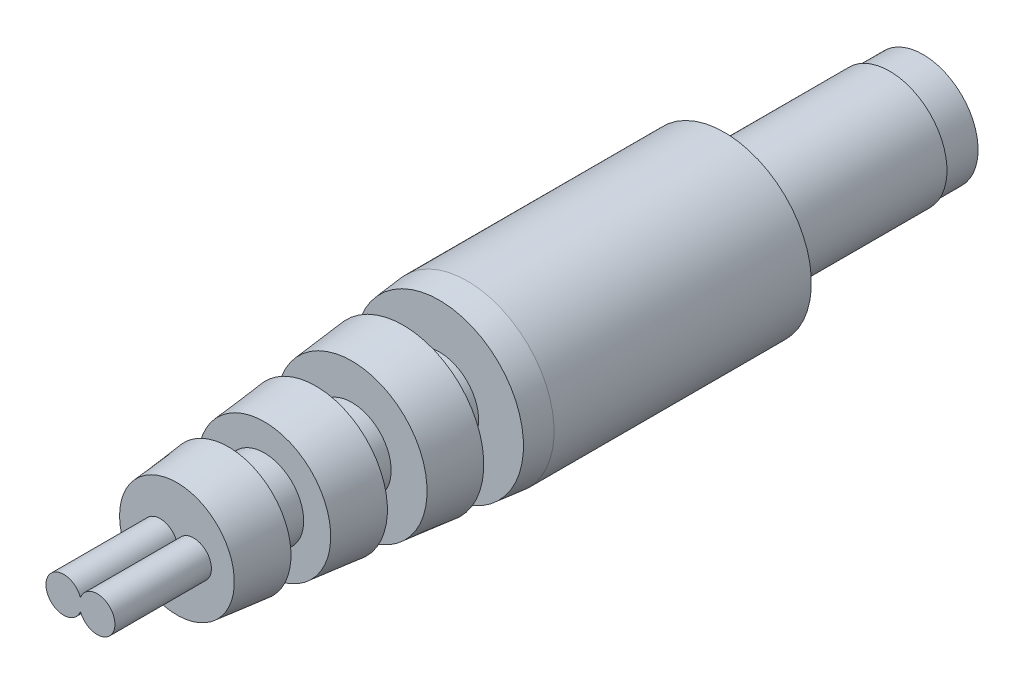
ISO-10303-21;
HEADER;
FILE_DESCRIPTION(('STEP AP214'),'2;1');
FILE_NAME('part.step','',(''),(''),'','','');
FILE_SCHEMA(('AUTOMOTIVE_DESIGN { 1 0 10303 214 1 1 1 1 }'));
ENDSEC;
DATA;
#1=APPLICATION_CONTEXT('core data for automotive mechanical design processes');
#2=APPLICATION_PROTOCOL_DEFINITION('international standard','automotive_design',2000,#1);
#3=PRODUCT_CONTEXT('',#1,'mechanical');
#4=PRODUCT('Part','Part','',(#3));
#5=PRODUCT_RELATED_PRODUCT_CATEGORY('part','',(#4));
#6=PRODUCT_DEFINITION_FORMATION('','',#4);
#7=PRODUCT_DEFINITION_CONTEXT('part definition',#1,'design');
#8=PRODUCT_DEFINITION('design','',#6,#7);
#9=PRODUCT_DEFINITION_SHAPE('','',#8);
#10=(LENGTH_UNIT() NAMED_UNIT(*) SI_UNIT(.MILLI.,.METRE.));
#11=(NAMED_UNIT(*) PLANE_ANGLE_UNIT() SI_UNIT($,.RADIAN.));
#12=(NAMED_UNIT(*) SI_UNIT($,.STERADIAN.) SOLID_ANGLE_UNIT());
#13=UNCERTAINTY_MEASURE_WITH_UNIT(LENGTH_MEASURE(1.E-05),#10,'distance_accuracy_value','');
#14=(GEOMETRIC_REPRESENTATION_CONTEXT(3) GLOBAL_UNCERTAINTY_ASSIGNED_CONTEXT((#13)) GLOBAL_UNIT_ASSIGNED_CONTEXT((#10,
#11,#12)) REPRESENTATION_CONTEXT('',''));
#15=CARTESIAN_POINT('',(0.,0.,0.));
#16=DIRECTION('',(0.,0.,1.));
#17=DIRECTION('',(1.,0.,0.));
#18=AXIS2_PLACEMENT_3D('',#15,#16,#17);
#19=CARTESIAN_POINT('',(0.,0.,41.5925));
#20=DIRECTION('',(0.,0.,-1.));
#21=DIRECTION('',(-1.,0.,0.));
#22=AXIS2_PLACEMENT_3D('',#19,#20,#21);
#23=PLANE('',#22);
#24=CARTESIAN_POINT('',(-0.826236930167257,0.,41.5925));
#25=DIRECTION('',(0.,0.,-1.));
#26=DIRECTION('',(-1.,0.,0.));
#27=AXIS2_PLACEMENT_3D('',#24,#25,#26);
#28=CIRCLE('',#27,0.8763);
#29=CARTESIAN_POINT('',(0.,-0.291949011349221,41.5925));
#30=VERTEX_POINT('',#29);
#31=CARTESIAN_POINT('',(0.,0.291949011349221,41.5925));
#32=VERTEX_POINT('',#31);
#33=EDGE_CURVE('E46',#30,#32,#28,.T.);
#34=ORIENTED_EDGE('',*,*,#33,.F.);
#35=CARTESIAN_POINT('',(0.826236930167257,0.,41.5925));
#36=DIRECTION('',(0.,0.,-1.));
#37=DIRECTION('',(-1.,0.,0.));
#38=AXIS2_PLACEMENT_3D('',#35,#36,#37);
#39=CIRCLE('',#38,0.8763);
#40=EDGE_CURVE('E20',#32,#30,#39,.T.);
#41=ORIENTED_EDGE('',*,*,#40,.F.);
#42=EDGE_LOOP('',(#34,#41));
#43=FACE_BOUND('',#42,.T.);
#44=ADVANCED_FACE('F17',(#43),#23,.F.);
#45=CARTESIAN_POINT('',(0.826236930167257,0.,41.5925));
#46=DIRECTION('',(0.,0.,-1.));
#47=DIRECTION('',(-1.,0.,0.));
#48=AXIS2_PLACEMENT_3D('',#45,#46,#47);
#49=CYLINDRICAL_SURFACE('',#48,0.8763);
#50=ORIENTED_EDGE('',*,*,#40,.T.);
#51=DIRECTION('',(0.,0.,-1.));
#52=VECTOR('',#51,1.);
#53=CARTESIAN_POINT('',(0.,-0.291949011349221,41.5925));
#54=LINE('',#53,#52);
#55=CARTESIAN_POINT('',(0.,-0.291949011349221,36.83));
#56=VERTEX_POINT('',#55);
#57=EDGE_CURVE('E48',#56,#30,#54,.F.);
#58=ORIENTED_EDGE('',*,*,#57,.F.);
#59=CARTESIAN_POINT('',(0.826236930167257,0.,36.83));
#60=DIRECTION('',(0.,0.,-1.));
#61=DIRECTION('',(-1.,0.,0.));
#62=AXIS2_PLACEMENT_3D('',#59,#60,#61);
#63=CIRCLE('',#62,0.8763);
#64=CARTESIAN_POINT('',(0.,0.291949011349221,36.83));
#65=VERTEX_POINT('',#64);
#66=EDGE_CURVE('E115',#65,#56,#63,.T.);
#67=ORIENTED_EDGE('',*,*,#66,.F.);
#68=DIRECTION('',(0.,0.,-1.));
#69=VECTOR('',#68,1.);
#70=CARTESIAN_POINT('',(0.,0.291949011349221,41.5925));
#71=LINE('',#70,#69);
#72=EDGE_CURVE('E47',#32,#65,#71,.T.);
#73=ORIENTED_EDGE('',*,*,#72,.F.);
#74=EDGE_LOOP('',(#50,#58,#67,#73));
#75=FACE_BOUND('',#74,.T.);
#76=ADVANCED_FACE('F50',(#75),#49,.T.);
#77=CARTESIAN_POINT('',(-0.826236930167257,0.,41.5925));
#78=DIRECTION('',(0.,0.,-1.));
#79=DIRECTION('',(-1.,0.,0.));
#80=AXIS2_PLACEMENT_3D('',#77,#78,#79);
#81=CYLINDRICAL_SURFACE('',#80,0.8763);
#82=ORIENTED_EDGE('',*,*,#72,.T.);
#83=CARTESIAN_POINT('',(-0.826236930167257,0.,36.83));
#84=DIRECTION('',(0.,0.,-1.));
#85=DIRECTION('',(-1.,0.,0.));
#86=AXIS2_PLACEMENT_3D('',#83,#84,#85);
#87=CIRCLE('',#86,0.8763);
#88=EDGE_CURVE('E35',#56,#65,#87,.T.);
#89=ORIENTED_EDGE('',*,*,#88,.F.);
#90=ORIENTED_EDGE('',*,*,#57,.T.);
#91=ORIENTED_EDGE('',*,*,#33,.T.);
#92=EDGE_LOOP('',(#82,#89,#90,#91));
#93=FACE_BOUND('',#92,.T.);
#94=ADVANCED_FACE('F52',(#93),#81,.T.);
#95=CARTESIAN_POINT('',(0.,0.,36.83));
#96=DIRECTION('',(0.,0.,1.));
#97=DIRECTION('',(1.,0.,0.));
#98=AXIS2_PLACEMENT_3D('',#95,#96,#97);
#99=PLANE('',#98);
#100=ORIENTED_EDGE('',*,*,#66,.T.);
#101=ORIENTED_EDGE('',*,*,#88,.T.);
#102=EDGE_LOOP('',(#100,#101));
#103=FACE_BOUND('',#102,.T.);
#104=CARTESIAN_POINT('',(0.,0.,36.830000000009));
#105=DIRECTION('',(0.,0.,-1.));
#106=DIRECTION('',(-1.,0.,0.));
#107=AXIS2_PLACEMENT_3D('',#104,#105,#106);
#108=CIRCLE('',#107,2.83209999999912);
#109=CARTESIAN_POINT('',(-2.83209999999912,0.,36.830000000009));
#110=VERTEX_POINT('',#109);
#111=EDGE_CURVE('E111',#110,#110,#108,.T.);
#112=ORIENTED_EDGE('',*,*,#111,.F.);
#113=EDGE_LOOP('',(#112));
#114=FACE_BOUND('',#113,.T.);
#115=ADVANCED_FACE('F117',(#103,#114),#99,.T.);
#116=CARTESIAN_POINT('',(0.,0.,34.2899999999986));
#117=DIRECTION('',(0.,0.,-1.));
#118=DIRECTION('',(-1.,0.,0.));
#119=AXIS2_PLACEMENT_3D('',#116,#117,#118);
#120=CONICAL_SURFACE('',#119,3.09105390071096,0.101599321440004);
#121=ORIENTED_EDGE('',*,*,#111,.T.);
#122=EDGE_LOOP('',(#121));
#123=FACE_BOUND('',#122,.T.);
#124=CARTESIAN_POINT('',(0.,0.,34.2899999999986));
#125=DIRECTION('',(0.,0.,-1.));
#126=DIRECTION('',(-1.,0.,0.));
#127=AXIS2_PLACEMENT_3D('',#124,#125,#126);
#128=CIRCLE('',#127,3.09105390071096);
#129=CARTESIAN_POINT('',(-3.09105390071096,0.,34.2899999999986));
#130=VERTEX_POINT('',#129);
#131=EDGE_CURVE('E108',#130,#130,#128,.T.);
#132=ORIENTED_EDGE('',*,*,#131,.F.);
#133=EDGE_LOOP('',(#132));
#134=FACE_BOUND('',#133,.T.);
#135=ADVANCED_FACE('F120',(#123,#134),#120,.T.);
#136=CARTESIAN_POINT('',(0.,3.09105390070922,34.29));
#137=DIRECTION('',(0.,0.,-1.));
#138=DIRECTION('',(-1.,0.,0.));
#139=AXIS2_PLACEMENT_3D('',#136,#137,#138);
#140=PLANE('',#139);
#141=CARTESIAN_POINT('',(0.,0.,34.29));
#142=DIRECTION('',(0.,0.,-1.));
#143=DIRECTION('',(-1.,0.,0.));
#144=AXIS2_PLACEMENT_3D('',#141,#142,#143);
#145=CIRCLE('',#144,1.93888495482852);
#146=CARTESIAN_POINT('',(-1.93888495482852,0.,34.29));
#147=VERTEX_POINT('',#146);
#148=EDGE_CURVE('E105',#147,#147,#145,.T.);
#149=ORIENTED_EDGE('',*,*,#148,.F.);
#150=EDGE_LOOP('',(#149));
#151=FACE_BOUND('',#150,.T.);
#152=ORIENTED_EDGE('',*,*,#131,.T.);
#153=EDGE_LOOP('',(#152));
#154=FACE_BOUND('',#153,.T.);
#155=ADVANCED_FACE('F126',(#151,#154),#140,.T.);
#156=CARTESIAN_POINT('',(0.,0.,0.));
#157=DIRECTION('',(0.,0.,-1.));
#158=DIRECTION('',(-1.,0.,0.));
#159=AXIS2_PLACEMENT_3D('',#156,#157,#158);
#160=CYLINDRICAL_SURFACE('',#159,1.93888495482852);
#161=ORIENTED_EDGE('',*,*,#148,.T.);
#162=EDGE_LOOP('',(#161));
#163=FACE_BOUND('',#162,.T.);
#164=CARTESIAN_POINT('',(0.,0.,32.512));
#165=DIRECTION('',(0.,0.,-1.));
#166=DIRECTION('',(-1.,0.,0.));
#167=AXIS2_PLACEMENT_3D('',#164,#165,#166);
#168=CIRCLE('',#167,1.93888495482852);
#169=CARTESIAN_POINT('',(-1.93888495482852,0.,32.512));
#170=VERTEX_POINT('',#169);
#171=EDGE_CURVE('E102',#170,#170,#168,.T.);
#172=ORIENTED_EDGE('',*,*,#171,.F.);
#173=EDGE_LOOP('',(#172));
#174=FACE_BOUND('',#173,.T.);
#175=ADVANCED_FACE('F131',(#163,#174),#160,.T.);
#176=CARTESIAN_POINT('',(0.,1.93888495482852,32.512));
#177=DIRECTION('',(0.,0.,1.));
#178=DIRECTION('',(1.,0.,0.));
#179=AXIS2_PLACEMENT_3D('',#176,#177,#178);
#180=PLANE('',#179);
#181=CARTESIAN_POINT('',(0.,0.,32.511999999997));
#182=DIRECTION('',(0.,0.,-1.));
#183=DIRECTION('',(-1.,0.,0.));
#184=AXIS2_PLACEMENT_3D('',#181,#182,#183);
#185=CIRCLE('',#184,3.27232163120914);
#186=CARTESIAN_POINT('',(-3.27232163120914,0.,32.511999999997));
#187=VERTEX_POINT('',#186);
#188=EDGE_CURVE('E99',#187,#187,#185,.T.);
#189=ORIENTED_EDGE('',*,*,#188,.F.);
#190=EDGE_LOOP('',(#189));
#191=FACE_BOUND('',#190,.T.);
#192=ORIENTED_EDGE('',*,*,#171,.T.);
#193=EDGE_LOOP('',(#192));
#194=FACE_BOUND('',#193,.T.);
#195=ADVANCED_FACE('F138',(#191,#194),#180,.T.);
#196=CARTESIAN_POINT('',(0.,0.,29.9719999998729));
#197=DIRECTION('',(0.,0.,-1.));
#198=DIRECTION('',(-1.,0.,0.));
#199=AXIS2_PLACEMENT_3D('',#196,#197,#198);
#200=CONICAL_SURFACE('',#199,3.53127553193389,0.101599321440515);
#201=ORIENTED_EDGE('',*,*,#188,.T.);
#202=EDGE_LOOP('',(#201));
#203=FACE_BOUND('',#202,.T.);
#204=CARTESIAN_POINT('',(0.,0.,29.9719999999866));
#205=DIRECTION('',(0.,0.,-1.));
#206=DIRECTION('',(-1.,0.,0.));
#207=AXIS2_PLACEMENT_3D('',#204,#205,#206);
#208=CIRCLE('',#207,3.5312755319223);
#209=CARTESIAN_POINT('',(-3.5312755319223,0.,29.9719999999866));
#210=VERTEX_POINT('',#209);
#211=EDGE_CURVE('E96',#210,#210,#208,.T.);
#212=ORIENTED_EDGE('',*,*,#211,.F.);
#213=EDGE_LOOP('',(#212));
#214=FACE_BOUND('',#213,.T.);
#215=ADVANCED_FACE('F209',(#203,#214),#200,.T.);
#216=CARTESIAN_POINT('',(0.,3.53127553191489,29.972));
#217=DIRECTION('',(0.,0.,-1.));
#218=DIRECTION('',(-1.,0.,0.));
#219=AXIS2_PLACEMENT_3D('',#216,#217,#218);
#220=PLANE('',#219);
#221=CARTESIAN_POINT('',(0.,0.,29.972));
#222=DIRECTION('',(0.,0.,-1.));
#223=DIRECTION('',(-1.,0.,0.));
#224=AXIS2_PLACEMENT_3D('',#221,#222,#223);
#225=CIRCLE('',#224,1.93888495482852);
#226=CARTESIAN_POINT('',(-1.93888495482852,0.,29.972));
#227=VERTEX_POINT('',#226);
#228=EDGE_CURVE('E93',#227,#227,#225,.T.);
#229=ORIENTED_EDGE('',*,*,#228,.F.);
#230=EDGE_LOOP('',(#229));
#231=FACE_BOUND('',#230,.T.);
#232=ORIENTED_EDGE('',*,*,#211,.T.);
#233=EDGE_LOOP('',(#232));
#234=FACE_BOUND('',#233,.T.);
#235=ADVANCED_FACE('F205',(#231,#234),#220,.T.);
#236=CARTESIAN_POINT('',(0.,0.,0.));
#237=DIRECTION('',(0.,0.,-1.));
#238=DIRECTION('',(-1.,0.,0.));
#239=AXIS2_PLACEMENT_3D('',#236,#237,#238);
#240=CYLINDRICAL_SURFACE('',#239,1.93888495482852);
#241=ORIENTED_EDGE('',*,*,#228,.T.);
#242=EDGE_LOOP('',(#241));
#243=FACE_BOUND('',#242,.T.);
#244=CARTESIAN_POINT('',(0.,0.,28.194));
#245=DIRECTION('',(0.,0.,-1.));
#246=DIRECTION('',(-1.,0.,0.));
#247=AXIS2_PLACEMENT_3D('',#244,#245,#246);
#248=CIRCLE('',#247,1.93888495482852);
#249=CARTESIAN_POINT('',(-1.93888495482852,0.,28.194));
#250=VERTEX_POINT('',#249);
#251=EDGE_CURVE('E90',#250,#250,#248,.T.);
#252=ORIENTED_EDGE('',*,*,#251,.F.);
#253=EDGE_LOOP('',(#252));
#254=FACE_BOUND('',#253,.T.);
#255=ADVANCED_FACE('F201',(#243,#254),#240,.T.);
#256=CARTESIAN_POINT('',(0.,0.,10.16));
#257=DIRECTION('',(0.,0.,-1.));
#258=DIRECTION('',(-1.,0.,0.));
#259=AXIS2_PLACEMENT_3D('',#256,#257,#258);
#260=PLANE('',#259);
#261=CARTESIAN_POINT('',(0.,0.,10.16));
#262=DIRECTION('',(0.,0.,-1.));
#263=DIRECTION('',(-1.,0.,0.));
#264=AXIS2_PLACEMENT_3D('',#261,#262,#263);
#265=CIRCLE('',#264,1.1049);
#266=CARTESIAN_POINT('',(-1.1049,0.,10.16));
#267=VERTEX_POINT('',#266);
#268=EDGE_CURVE('E87',#267,#267,#265,.T.);
#269=ORIENTED_EDGE('',*,*,#268,.T.);
#270=EDGE_LOOP('',(#269));
#271=FACE_BOUND('',#270,.T.);
#272=ADVANCED_FACE('F197',(#271),#260,.T.);
#273=CARTESIAN_POINT('',(0.,1.93888495482852,28.194));
#274=DIRECTION('',(0.,0.,1.));
#275=DIRECTION('',(1.,0.,0.));
#276=AXIS2_PLACEMENT_3D('',#273,#274,#275);
#277=PLANE('',#276);
#278=CARTESIAN_POINT('',(0.,0.,28.193999999985));
#279=DIRECTION('',(0.,0.,-1.));
#280=DIRECTION('',(-1.,0.,0.));
#281=AXIS2_PLACEMENT_3D('',#278,#279,#280);
#282=CIRCLE('',#281,3.71254326241524);
#283=CARTESIAN_POINT('',(-3.71254326241524,0.,28.193999999985));
#284=VERTEX_POINT('',#283);
#285=EDGE_CURVE('E84',#284,#284,#282,.T.);
#286=ORIENTED_EDGE('',*,*,#285,.F.);
#287=EDGE_LOOP('',(#286));
#288=FACE_BOUND('',#287,.T.);
#289=ORIENTED_EDGE('',*,*,#251,.T.);
#290=EDGE_LOOP('',(#289));
#291=FACE_BOUND('',#290,.T.);
#292=ADVANCED_FACE('F193',(#288,#291),#277,.T.);
#293=CARTESIAN_POINT('',(0.,0.,10.16));
#294=DIRECTION('',(0.,0.,-1.));
#295=DIRECTION('',(-1.,0.,0.));
#296=AXIS2_PLACEMENT_3D('',#293,#294,#295);
#297=CYLINDRICAL_SURFACE('',#296,1.1049);
#298=CARTESIAN_POINT('',(0.,0.,0.));
#299=DIRECTION('',(0.,0.,-1.));
#300=DIRECTION('',(-1.,0.,0.));
#301=AXIS2_PLACEMENT_3D('',#298,#299,#300);
#302=CIRCLE('',#301,1.1049);
#303=CARTESIAN_POINT('',(-1.1049,0.,0.));
#304=VERTEX_POINT('',#303);
#305=EDGE_CURVE('E81',#304,#304,#302,.F.);
#306=ORIENTED_EDGE('',*,*,#305,.F.);
#307=EDGE_LOOP('',(#306));
#308=FACE_BOUND('',#307,.T.);
#309=ORIENTED_EDGE('',*,*,#268,.F.);
#310=EDGE_LOOP('',(#309));
#311=FACE_BOUND('',#310,.T.);
#312=ADVANCED_FACE('F189',(#308,#311),#297,.F.);
#313=CARTESIAN_POINT('',(0.,0.,25.6540000000314));
#314=DIRECTION('',(0.,0.,-1.));
#315=DIRECTION('',(-1.,0.,0.));
#316=AXIS2_PLACEMENT_3D('',#313,#314,#315);
#317=CONICAL_SURFACE('',#316,3.97149716312128,0.101599321440004);
#318=ORIENTED_EDGE('',*,*,#285,.T.);
#319=EDGE_LOOP('',(#318));
#320=FACE_BOUND('',#319,.T.);
#321=CARTESIAN_POINT('',(0.,0.,25.6539999999745));
#322=DIRECTION('',(0.,0.,-1.));
#323=DIRECTION('',(-1.,0.,0.));
#324=AXIS2_PLACEMENT_3D('',#321,#322,#323);
#325=CIRCLE('',#324,3.97149716312708);
#326=CARTESIAN_POINT('',(-3.97149716312708,0.,25.6539999999745));
#327=VERTEX_POINT('',#326);
#328=EDGE_CURVE('E78',#327,#327,#325,.T.);
#329=ORIENTED_EDGE('',*,*,#328,.F.);
#330=EDGE_LOOP('',(#329));
#331=FACE_BOUND('',#330,.T.);
#332=ADVANCED_FACE('F185',(#320,#331),#317,.T.);
#333=CARTESIAN_POINT('',(0.,0.,0.));
#334=DIRECTION('',(0.,0.,-1.));
#335=DIRECTION('',(-1.,0.,0.));
#336=AXIS2_PLACEMENT_3D('',#333,#334,#335);
#337=PLANE('',#336);
#338=CARTESIAN_POINT('',(0.,0.,0.));
#339=DIRECTION('',(0.,0.,-1.));
#340=DIRECTION('',(-1.,0.,0.));
#341=AXIS2_PLACEMENT_3D('',#338,#339,#340);
#342=CIRCLE('',#341,2.7178);
#343=CARTESIAN_POINT('',(-2.7178,0.,0.));
#344=VERTEX_POINT('',#343);
#345=EDGE_CURVE('E75',#344,#344,#342,.F.);
#346=ORIENTED_EDGE('',*,*,#345,.F.);
#347=EDGE_LOOP('',(#346));
#348=FACE_BOUND('',#347,.T.);
#349=ORIENTED_EDGE('',*,*,#305,.T.);
#350=EDGE_LOOP('',(#349));
#351=FACE_BOUND('',#350,.T.);
#352=ADVANCED_FACE('F181',(#348,#351),#337,.T.);
#353=CARTESIAN_POINT('',(0.,3.97149716312057,25.654));
#354=DIRECTION('',(0.,0.,-1.));
#355=DIRECTION('',(-1.,0.,0.));
#356=AXIS2_PLACEMENT_3D('',#353,#354,#355);
#357=PLANE('',#356);
#358=CARTESIAN_POINT('',(0.,0.,25.654));
#359=DIRECTION('',(0.,0.,-1.));
#360=DIRECTION('',(-1.,0.,0.));
#361=AXIS2_PLACEMENT_3D('',#358,#359,#360);
#362=CIRCLE('',#361,1.93888495482852);
#363=CARTESIAN_POINT('',(-1.93888495482852,0.,25.654));
#364=VERTEX_POINT('',#363);
#365=EDGE_CURVE('E72',#364,#364,#362,.T.);
#366=ORIENTED_EDGE('',*,*,#365,.F.);
#367=EDGE_LOOP('',(#366));
#368=FACE_BOUND('',#367,.T.);
#369=ORIENTED_EDGE('',*,*,#328,.T.);
#370=EDGE_LOOP('',(#369));
#371=FACE_BOUND('',#370,.T.);
#372=ADVANCED_FACE('F177',(#368,#371),#357,.T.);
#373=CARTESIAN_POINT('',(0.,0.,0.));
#374=DIRECTION('',(0.,0.,-1.));
#375=DIRECTION('',(-1.,0.,0.));
#376=AXIS2_PLACEMENT_3D('',#373,#374,#375);
#377=CYLINDRICAL_SURFACE('',#376,2.7178);
#378=CARTESIAN_POINT('',(0.,0.,1.651));
#379=DIRECTION('',(0.,0.,-1.));
#380=DIRECTION('',(-1.,0.,0.));
#381=AXIS2_PLACEMENT_3D('',#378,#379,#380);
#382=CIRCLE('',#381,2.7178);
#383=CARTESIAN_POINT('',(-2.7178,0.,1.651));
#384=VERTEX_POINT('',#383);
#385=EDGE_CURVE('E69',#384,#384,#382,.F.);
#386=ORIENTED_EDGE('',*,*,#385,.F.);
#387=EDGE_LOOP('',(#386));
#388=FACE_BOUND('',#387,.T.);
#389=ORIENTED_EDGE('',*,*,#345,.T.);
#390=EDGE_LOOP('',(#389));
#391=FACE_BOUND('',#390,.T.);
#392=ADVANCED_FACE('F173',(#388,#391),#377,.T.);
#393=CARTESIAN_POINT('',(0.,0.,0.));
#394=DIRECTION('',(0.,0.,-1.));
#395=DIRECTION('',(-1.,0.,0.));
#396=AXIS2_PLACEMENT_3D('',#393,#394,#395);
#397=CYLINDRICAL_SURFACE('',#396,1.93888495482852);
#398=ORIENTED_EDGE('',*,*,#365,.T.);
#399=EDGE_LOOP('',(#398));
#400=FACE_BOUND('',#399,.T.);
#401=CARTESIAN_POINT('',(0.,0.,23.876));
#402=DIRECTION('',(0.,0.,-1.));
#403=DIRECTION('',(-1.,0.,0.));
#404=AXIS2_PLACEMENT_3D('',#401,#402,#403);
#405=CIRCLE('',#404,1.93888495482852);
#406=CARTESIAN_POINT('',(-1.93888495482852,0.,23.876));
#407=VERTEX_POINT('',#406);
#408=EDGE_CURVE('E66',#407,#407,#405,.T.);
#409=ORIENTED_EDGE('',*,*,#408,.F.);
#410=EDGE_LOOP('',(#409));
#411=FACE_BOUND('',#410,.T.);
#412=ADVANCED_FACE('F169',(#400,#411),#397,.T.);
#413=CARTESIAN_POINT('',(0.,2.8321,1.651));
#414=DIRECTION('',(0.,0.,-1.));
#415=DIRECTION('',(-1.,0.,0.));
#416=AXIS2_PLACEMENT_3D('',#413,#414,#415);
#417=PLANE('',#416);
#418=ORIENTED_EDGE('',*,*,#385,.T.);
#419=EDGE_LOOP('',(#418));
#420=FACE_BOUND('',#419,.T.);
#421=CARTESIAN_POINT('',(0.,0.,1.651));
#422=DIRECTION('',(0.,0.,-1.));
#423=DIRECTION('',(-1.,0.,0.));
#424=AXIS2_PLACEMENT_3D('',#421,#422,#423);
#425=CIRCLE('',#424,2.8321);
#426=CARTESIAN_POINT('',(-2.8321,0.,1.651));
#427=VERTEX_POINT('',#426);
#428=EDGE_CURVE('E63',#427,#427,#425,.F.);
#429=ORIENTED_EDGE('',*,*,#428,.F.);
#430=EDGE_LOOP('',(#429));
#431=FACE_BOUND('',#430,.T.);
#432=ADVANCED_FACE('F165',(#420,#431),#417,.T.);
#433=CARTESIAN_POINT('',(0.,1.93888495482852,23.876));
#434=DIRECTION('',(0.,0.,1.));
#435=DIRECTION('',(1.,0.,0.));
#436=AXIS2_PLACEMENT_3D('',#433,#434,#435);
#437=PLANE('',#436);
#438=CARTESIAN_POINT('',(0.,0.,23.8760000000298));
#439=DIRECTION('',(0.,0.,-1.));
#440=DIRECTION('',(-1.,0.,0.));
#441=AXIS2_PLACEMENT_3D('',#438,#439,#440);
#442=CIRCLE('',#441,4.15276489361105);
#443=CARTESIAN_POINT('',(-4.15276489361105,0.,23.8760000000298));
#444=VERTEX_POINT('',#443);
#445=EDGE_CURVE('E60',#444,#444,#442,.T.);
#446=ORIENTED_EDGE('',*,*,#445,.F.);
#447=EDGE_LOOP('',(#446));
#448=FACE_BOUND('',#447,.T.);
#449=ORIENTED_EDGE('',*,*,#408,.T.);
#450=EDGE_LOOP('',(#449));
#451=FACE_BOUND('',#450,.T.);
#452=ADVANCED_FACE('F161',(#448,#451),#437,.T.);
#453=CARTESIAN_POINT('',(0.,0.,0.));
#454=DIRECTION('',(0.,0.,-1.));
#455=DIRECTION('',(-1.,0.,0.));
#456=AXIS2_PLACEMENT_3D('',#453,#454,#455);
#457=CYLINDRICAL_SURFACE('',#456,2.8321);
#458=CARTESIAN_POINT('',(0.,0.,9.8044));
#459=DIRECTION('',(0.,0.,-1.));
#460=DIRECTION('',(-1.,0.,0.));
#461=AXIS2_PLACEMENT_3D('',#458,#459,#460);
#462=CIRCLE('',#461,2.8321);
#463=CARTESIAN_POINT('',(-2.8321,0.,9.8044));
#464=VERTEX_POINT('',#463);
#465=EDGE_CURVE('E57',#464,#464,#462,.F.);
#466=ORIENTED_EDGE('',*,*,#465,.F.);
#467=EDGE_LOOP('',(#466));
#468=FACE_BOUND('',#467,.T.);
#469=ORIENTED_EDGE('',*,*,#428,.T.);
#470=EDGE_LOOP('',(#469));
#471=FACE_BOUND('',#470,.T.);
#472=ADVANCED_FACE('F157',(#468,#471),#457,.T.);
#473=CARTESIAN_POINT('',(0.,0.,22.5044000000594));
#474=DIRECTION('',(0.,0.,-1.));
#475=DIRECTION('',(-1.,0.,0.));
#476=AXIS2_PLACEMENT_3D('',#473,#474,#475);
#477=CONICAL_SURFACE('',#476,4.29259999999232,0.101599321440341);
#478=CARTESIAN_POINT('',(0.,0.,22.5044));
#479=DIRECTION('',(0.,0.,-1.));
#480=DIRECTION('',(-1.,0.,0.));
#481=AXIS2_PLACEMENT_3D('',#478,#479,#480);
#482=CIRCLE('',#481,4.2926);
#483=CARTESIAN_POINT('',(-4.2926,0.,22.5044));
#484=VERTEX_POINT('',#483);
#485=EDGE_CURVE('E26',#484,#484,#482,.T.);
#486=ORIENTED_EDGE('',*,*,#485,.F.);
#487=EDGE_LOOP('',(#486));
#488=FACE_BOUND('',#487,.T.);
#489=ORIENTED_EDGE('',*,*,#445,.T.);
#490=EDGE_LOOP('',(#489));
#491=FACE_BOUND('',#490,.T.);
#492=ADVANCED_FACE('F150',(#488,#491),#477,.T.);
#493=CARTESIAN_POINT('',(0.,2.8321,9.8044));
#494=DIRECTION('',(0.,0.,-1.));
#495=DIRECTION('',(-1.,0.,0.));
#496=AXIS2_PLACEMENT_3D('',#493,#494,#495);
#497=PLANE('',#496);
#498=ORIENTED_EDGE('',*,*,#465,.T.);
#499=EDGE_LOOP('',(#498));
#500=FACE_BOUND('',#499,.T.);
#501=CARTESIAN_POINT('',(0.,0.,9.8044));
#502=DIRECTION('',(0.,0.,-1.));
#503=DIRECTION('',(-1.,0.,0.));
#504=AXIS2_PLACEMENT_3D('',#501,#502,#503);
#505=CIRCLE('',#504,4.2926);
#506=CARTESIAN_POINT('',(-4.2926,0.,9.8044));
#507=VERTEX_POINT('',#506);
#508=EDGE_CURVE('E11',#507,#507,#505,.F.);
#509=ORIENTED_EDGE('',*,*,#508,.F.);
#510=EDGE_LOOP('',(#509));
#511=FACE_BOUND('',#510,.T.);
#512=ADVANCED_FACE('F144',(#500,#511),#497,.T.);
#513=CARTESIAN_POINT('',(0.,0.,0.));
#514=DIRECTION('',(0.,0.,-1.));
#515=DIRECTION('',(-1.,0.,0.));
#516=AXIS2_PLACEMENT_3D('',#513,#514,#515);
#517=CYLINDRICAL_SURFACE('',#516,4.2926);
#518=ORIENTED_EDGE('',*,*,#508,.T.);
#519=EDGE_LOOP('',(#518));
#520=FACE_BOUND('',#519,.T.);
#521=ORIENTED_EDGE('',*,*,#485,.T.);
#522=EDGE_LOOP('',(#521));
#523=FACE_BOUND('',#522,.T.);
#524=ADVANCED_FACE('F142',(#520,#523),#517,.T.);
#525=CLOSED_SHELL('',(#44,#76,#94,#115,#135,#155,#175,#195,#215,#235,#255,#272,#292,#312,#332,
#352,#372,#392,#412,#432,#452,#472,#492,#512,#524));
#526=MANIFOLD_SOLID_BREP('B1',#525);
#527=ADVANCED_BREP_SHAPE_REPRESENTATION('',(#18,#526),#14);
#528=SHAPE_DEFINITION_REPRESENTATION(#9,#527);
ENDSEC;
END-ISO-10303-21;
